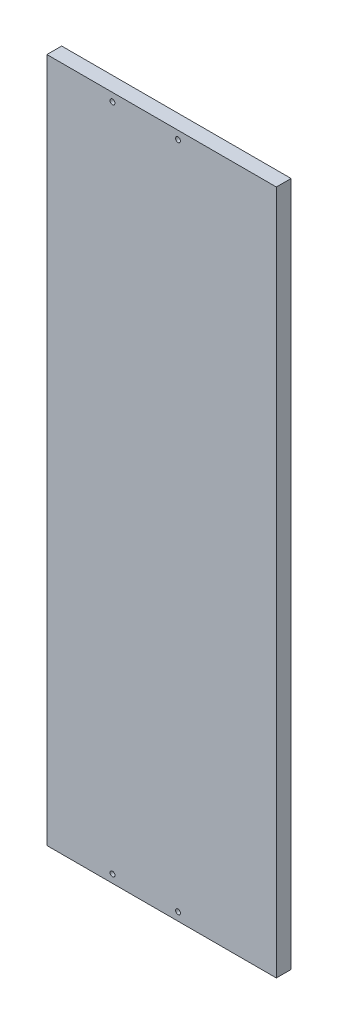
ISO-10303-21;
HEADER;
FILE_DESCRIPTION(('STEP AP214'),'2;1');
FILE_NAME('part.step','',(''),(''),'','','');
FILE_SCHEMA(('AUTOMOTIVE_DESIGN { 1 0 10303 214 1 1 1 1 }'));
ENDSEC;
DATA;
#1=APPLICATION_CONTEXT('core data for automotive mechanical design processes');
#2=APPLICATION_PROTOCOL_DEFINITION('international standard','automotive_design',2000,#1);
#3=PRODUCT_CONTEXT('',#1,'mechanical');
#4=PRODUCT('Part','Part','',(#3));
#5=PRODUCT_RELATED_PRODUCT_CATEGORY('part','',(#4));
#6=PRODUCT_DEFINITION_FORMATION('','',#4);
#7=PRODUCT_DEFINITION_CONTEXT('part definition',#1,'design');
#8=PRODUCT_DEFINITION('design','',#6,#7);
#9=PRODUCT_DEFINITION_SHAPE('','',#8);
#10=(LENGTH_UNIT() NAMED_UNIT(*) SI_UNIT(.MILLI.,.METRE.));
#11=(NAMED_UNIT(*) PLANE_ANGLE_UNIT() SI_UNIT($,.RADIAN.));
#12=(NAMED_UNIT(*) SI_UNIT($,.STERADIAN.) SOLID_ANGLE_UNIT());
#13=UNCERTAINTY_MEASURE_WITH_UNIT(LENGTH_MEASURE(1.E-05),#10,'distance_accuracy_value','');
#14=(GEOMETRIC_REPRESENTATION_CONTEXT(3) GLOBAL_UNCERTAINTY_ASSIGNED_CONTEXT((#13)) GLOBAL_UNIT_ASSIGNED_CONTEXT((#10,
#11,#12)) REPRESENTATION_CONTEXT('',''));
#15=CARTESIAN_POINT('',(0.,0.,0.));
#16=DIRECTION('',(0.,0.,1.));
#17=DIRECTION('',(1.,0.,0.));
#18=AXIS2_PLACEMENT_3D('',#15,#16,#17);
#19=CARTESIAN_POINT('',(140.,0.,0.));
#20=DIRECTION('',(1.,0.,0.));
#21=DIRECTION('',(0.,0.,-1.));
#22=AXIS2_PLACEMENT_3D('',#19,#20,#21);
#23=PLANE('',#22);
#24=DIRECTION('',(0.,1.,0.));
#25=VECTOR('',#24,1.);
#26=CARTESIAN_POINT('',(140.,0.,9.));
#27=LINE('',#26,#25);
#28=CARTESIAN_POINT('',(140.,0.,9.));
#29=VERTEX_POINT('',#28);
#30=CARTESIAN_POINT('',(140.,418.,9.));
#31=VERTEX_POINT('',#30);
#32=EDGE_CURVE('E100',#29,#31,#27,.T.);
#33=ORIENTED_EDGE('',*,*,#32,.F.);
#34=DIRECTION('',(0.,0.,1.));
#35=VECTOR('',#34,1.);
#36=CARTESIAN_POINT('',(140.,0.,0.));
#37=LINE('',#36,#35);
#38=CARTESIAN_POINT('',(140.,0.,0.));
#39=VERTEX_POINT('',#38);
#40=EDGE_CURVE('E11',#39,#29,#37,.T.);
#41=ORIENTED_EDGE('',*,*,#40,.F.);
#42=DIRECTION('',(0.,1.,0.));
#43=VECTOR('',#42,1.);
#44=CARTESIAN_POINT('',(140.,0.,0.));
#45=LINE('',#44,#43);
#46=CARTESIAN_POINT('',(140.,418.,0.));
#47=VERTEX_POINT('',#46);
#48=EDGE_CURVE('E93',#39,#47,#45,.T.);
#49=ORIENTED_EDGE('',*,*,#48,.T.);
#50=DIRECTION('',(0.,0.,1.));
#51=VECTOR('',#50,1.);
#52=CARTESIAN_POINT('',(140.,418.,0.));
#53=LINE('',#52,#51);
#54=EDGE_CURVE('E38',#47,#31,#53,.T.);
#55=ORIENTED_EDGE('',*,*,#54,.T.);
#56=EDGE_LOOP('',(#33,#41,#49,#55));
#57=FACE_BOUND('',#56,.T.);
#58=ADVANCED_FACE('F35',(#57),#23,.T.);
#59=CARTESIAN_POINT('',(0.,0.,0.));
#60=DIRECTION('',(0.,-1.,0.));
#61=DIRECTION('',(0.,0.,-1.));
#62=AXIS2_PLACEMENT_3D('',#59,#60,#61);
#63=PLANE('',#62);
#64=DIRECTION('',(1.,0.,0.));
#65=VECTOR('',#64,1.);
#66=CARTESIAN_POINT('',(0.,0.,9.));
#67=LINE('',#66,#65);
#68=CARTESIAN_POINT('',(0.,0.,9.));
#69=VERTEX_POINT('',#68);
#70=EDGE_CURVE('E95',#69,#29,#67,.T.);
#71=ORIENTED_EDGE('',*,*,#70,.F.);
#72=DIRECTION('',(0.,0.,1.));
#73=VECTOR('',#72,1.);
#74=CARTESIAN_POINT('',(0.,0.,0.));
#75=LINE('',#74,#73);
#76=CARTESIAN_POINT('',(0.,0.,0.));
#77=VERTEX_POINT('',#76);
#78=EDGE_CURVE('E44',#77,#69,#75,.T.);
#79=ORIENTED_EDGE('',*,*,#78,.F.);
#80=DIRECTION('',(1.,0.,0.));
#81=VECTOR('',#80,1.);
#82=CARTESIAN_POINT('',(0.,0.,0.));
#83=LINE('',#82,#81);
#84=EDGE_CURVE('E90',#77,#39,#83,.T.);
#85=ORIENTED_EDGE('',*,*,#84,.T.);
#86=ORIENTED_EDGE('',*,*,#40,.T.);
#87=EDGE_LOOP('',(#71,#79,#85,#86));
#88=FACE_BOUND('',#87,.T.);
#89=ADVANCED_FACE('F111',(#88),#63,.T.);
#90=CARTESIAN_POINT('',(0.,418.,0.));
#91=DIRECTION('',(-1.,0.,0.));
#92=DIRECTION('',(0.,0.,1.));
#93=AXIS2_PLACEMENT_3D('',#90,#91,#92);
#94=PLANE('',#93);
#95=DIRECTION('',(0.,-1.,0.));
#96=VECTOR('',#95,1.);
#97=CARTESIAN_POINT('',(0.,418.,9.));
#98=LINE('',#97,#96);
#99=CARTESIAN_POINT('',(0.,418.,9.));
#100=VERTEX_POINT('',#99);
#101=EDGE_CURVE('E85',#100,#69,#98,.T.);
#102=ORIENTED_EDGE('',*,*,#101,.F.);
#103=DIRECTION('',(0.,0.,1.));
#104=VECTOR('',#103,1.);
#105=CARTESIAN_POINT('',(0.,418.,0.));
#106=LINE('',#105,#104);
#107=CARTESIAN_POINT('',(0.,418.,0.));
#108=VERTEX_POINT('',#107);
#109=EDGE_CURVE('E80',#108,#100,#106,.T.);
#110=ORIENTED_EDGE('',*,*,#109,.F.);
#111=DIRECTION('',(0.,-1.,0.));
#112=VECTOR('',#111,1.);
#113=CARTESIAN_POINT('',(0.,418.,0.));
#114=LINE('',#113,#112);
#115=EDGE_CURVE('E83',#108,#77,#114,.T.);
#116=ORIENTED_EDGE('',*,*,#115,.T.);
#117=ORIENTED_EDGE('',*,*,#78,.T.);
#118=EDGE_LOOP('',(#102,#110,#116,#117));
#119=FACE_BOUND('',#118,.T.);
#120=ADVANCED_FACE('F82',(#119),#94,.T.);
#121=CARTESIAN_POINT('',(140.,418.,0.));
#122=DIRECTION('',(0.,1.,0.));
#123=DIRECTION('',(0.,0.,1.));
#124=AXIS2_PLACEMENT_3D('',#121,#122,#123);
#125=PLANE('',#124);
#126=DIRECTION('',(-1.,0.,0.));
#127=VECTOR('',#126,1.);
#128=CARTESIAN_POINT('',(140.,418.,9.));
#129=LINE('',#128,#127);
#130=EDGE_CURVE('E103',#31,#100,#129,.T.);
#131=ORIENTED_EDGE('',*,*,#130,.F.);
#132=ORIENTED_EDGE('',*,*,#54,.F.);
#133=DIRECTION('',(-1.,0.,0.));
#134=VECTOR('',#133,1.);
#135=CARTESIAN_POINT('',(140.,418.,0.));
#136=LINE('',#135,#134);
#137=EDGE_CURVE('E89',#47,#108,#136,.T.);
#138=ORIENTED_EDGE('',*,*,#137,.T.);
#139=ORIENTED_EDGE('',*,*,#109,.T.);
#140=EDGE_LOOP('',(#131,#132,#138,#139));
#141=FACE_BOUND('',#140,.T.);
#142=ADVANCED_FACE('F92',(#141),#125,.T.);
#143=CARTESIAN_POINT('',(0.,0.,0.));
#144=DIRECTION('',(0.,0.,1.));
#145=DIRECTION('',(1.,0.,0.));
#146=AXIS2_PLACEMENT_3D('',#143,#144,#145);
#147=PLANE('',#146);
#148=CARTESIAN_POINT('',(80.,5.,0.));
#149=DIRECTION('',(0.,0.,1.));
#150=DIRECTION('',(-1.,0.,0.));
#151=AXIS2_PLACEMENT_3D('',#148,#149,#150);
#152=CIRCLE('',#151,1.5);
#153=CARTESIAN_POINT('',(78.5,5.,0.));
#154=VERTEX_POINT('',#153);
#155=EDGE_CURVE('E152',#154,#154,#152,.T.);
#156=ORIENTED_EDGE('',*,*,#155,.T.);
#157=EDGE_LOOP('',(#156));
#158=FACE_BOUND('',#157,.T.);
#159=CARTESIAN_POINT('',(40.,5.,0.));
#160=DIRECTION('',(0.,0.,1.));
#161=DIRECTION('',(-1.,0.,0.));
#162=AXIS2_PLACEMENT_3D('',#159,#160,#161);
#163=CIRCLE('',#162,1.5);
#164=CARTESIAN_POINT('',(38.5,5.,0.));
#165=VERTEX_POINT('',#164);
#166=EDGE_CURVE('E160',#165,#165,#163,.T.);
#167=ORIENTED_EDGE('',*,*,#166,.T.);
#168=EDGE_LOOP('',(#167));
#169=FACE_BOUND('',#168,.T.);
#170=CARTESIAN_POINT('',(40.,413.,0.));
#171=DIRECTION('',(0.,0.,1.));
#172=DIRECTION('',(-1.,0.,0.));
#173=AXIS2_PLACEMENT_3D('',#170,#171,#172);
#174=CIRCLE('',#173,1.5);
#175=CARTESIAN_POINT('',(38.5,413.,0.));
#176=VERTEX_POINT('',#175);
#177=EDGE_CURVE('E166',#176,#176,#174,.T.);
#178=ORIENTED_EDGE('',*,*,#177,.T.);
#179=EDGE_LOOP('',(#178));
#180=FACE_BOUND('',#179,.T.);
#181=CARTESIAN_POINT('',(80.,413.,0.));
#182=DIRECTION('',(0.,0.,1.));
#183=DIRECTION('',(-1.,0.,0.));
#184=AXIS2_PLACEMENT_3D('',#181,#182,#183);
#185=CIRCLE('',#184,1.5);
#186=CARTESIAN_POINT('',(78.5,413.,0.));
#187=VERTEX_POINT('',#186);
#188=EDGE_CURVE('E104',#187,#187,#185,.T.);
#189=ORIENTED_EDGE('',*,*,#188,.T.);
#190=EDGE_LOOP('',(#189));
#191=FACE_BOUND('',#190,.T.);
#192=ORIENTED_EDGE('',*,*,#48,.F.);
#193=ORIENTED_EDGE('',*,*,#84,.F.);
#194=ORIENTED_EDGE('',*,*,#115,.F.);
#195=ORIENTED_EDGE('',*,*,#137,.F.);
#196=EDGE_LOOP('',(#192,#193,#194,#195));
#197=FACE_BOUND('',#196,.T.);
#198=ADVANCED_FACE('F88',(#158,#169,#180,#191,#197),#147,.F.);
#199=CARTESIAN_POINT('',(0.,0.,9.));
#200=DIRECTION('',(0.,0.,1.));
#201=DIRECTION('',(1.,0.,0.));
#202=AXIS2_PLACEMENT_3D('',#199,#200,#201);
#203=PLANE('',#202);
#204=CARTESIAN_POINT('',(80.,5.,9.));
#205=DIRECTION('',(0.,0.,1.));
#206=DIRECTION('',(-1.,0.,0.));
#207=AXIS2_PLACEMENT_3D('',#204,#205,#206);
#208=CIRCLE('',#207,1.5);
#209=CARTESIAN_POINT('',(78.5,5.,9.));
#210=VERTEX_POINT('',#209);
#211=EDGE_CURVE('E155',#210,#210,#208,.T.);
#212=ORIENTED_EDGE('',*,*,#211,.F.);
#213=EDGE_LOOP('',(#212));
#214=FACE_BOUND('',#213,.T.);
#215=CARTESIAN_POINT('',(40.,5.,9.));
#216=DIRECTION('',(0.,0.,1.));
#217=DIRECTION('',(-1.,0.,0.));
#218=AXIS2_PLACEMENT_3D('',#215,#216,#217);
#219=CIRCLE('',#218,1.5);
#220=CARTESIAN_POINT('',(38.5,5.,9.));
#221=VERTEX_POINT('',#220);
#222=EDGE_CURVE('E157',#221,#221,#219,.T.);
#223=ORIENTED_EDGE('',*,*,#222,.F.);
#224=EDGE_LOOP('',(#223));
#225=FACE_BOUND('',#224,.T.);
#226=CARTESIAN_POINT('',(40.,413.,9.));
#227=DIRECTION('',(0.,0.,1.));
#228=DIRECTION('',(-1.,0.,0.));
#229=AXIS2_PLACEMENT_3D('',#226,#227,#228);
#230=CIRCLE('',#229,1.5);
#231=CARTESIAN_POINT('',(38.5,413.,9.));
#232=VERTEX_POINT('',#231);
#233=EDGE_CURVE('E163',#232,#232,#230,.T.);
#234=ORIENTED_EDGE('',*,*,#233,.F.);
#235=EDGE_LOOP('',(#234));
#236=FACE_BOUND('',#235,.T.);
#237=CARTESIAN_POINT('',(80.,413.,9.));
#238=DIRECTION('',(0.,0.,1.));
#239=DIRECTION('',(-1.,0.,0.));
#240=AXIS2_PLACEMENT_3D('',#237,#238,#239);
#241=CIRCLE('',#240,1.5);
#242=CARTESIAN_POINT('',(78.5,413.,9.));
#243=VERTEX_POINT('',#242);
#244=EDGE_CURVE('E169',#243,#243,#241,.T.);
#245=ORIENTED_EDGE('',*,*,#244,.F.);
#246=EDGE_LOOP('',(#245));
#247=FACE_BOUND('',#246,.T.);
#248=ORIENTED_EDGE('',*,*,#32,.T.);
#249=ORIENTED_EDGE('',*,*,#130,.T.);
#250=ORIENTED_EDGE('',*,*,#101,.T.);
#251=ORIENTED_EDGE('',*,*,#70,.T.);
#252=EDGE_LOOP('',(#248,#249,#250,#251));
#253=FACE_BOUND('',#252,.T.);
#254=ADVANCED_FACE('F110',(#214,#225,#236,#247,#253),#203,.T.);
#255=CARTESIAN_POINT('',(80.,413.,0.));
#256=DIRECTION('',(0.,0.,1.));
#257=DIRECTION('',(1.,0.,0.));
#258=AXIS2_PLACEMENT_3D('',#255,#256,#257);
#259=CYLINDRICAL_SURFACE('',#258,1.5);
#260=ORIENTED_EDGE('',*,*,#188,.F.);
#261=EDGE_LOOP('',(#260));
#262=FACE_BOUND('',#261,.T.);
#263=ORIENTED_EDGE('',*,*,#244,.T.);
#264=EDGE_LOOP('',(#263));
#265=FACE_BOUND('',#264,.T.);
#266=ADVANCED_FACE('F129',(#262,#265),#259,.F.);
#267=CARTESIAN_POINT('',(40.,413.,0.));
#268=DIRECTION('',(0.,0.,1.));
#269=DIRECTION('',(1.,0.,0.));
#270=AXIS2_PLACEMENT_3D('',#267,#268,#269);
#271=CYLINDRICAL_SURFACE('',#270,1.5);
#272=ORIENTED_EDGE('',*,*,#177,.F.);
#273=EDGE_LOOP('',(#272));
#274=FACE_BOUND('',#273,.T.);
#275=ORIENTED_EDGE('',*,*,#233,.T.);
#276=EDGE_LOOP('',(#275));
#277=FACE_BOUND('',#276,.T.);
#278=ADVANCED_FACE('F136',(#274,#277),#271,.F.);
#279=CARTESIAN_POINT('',(40.,5.,0.));
#280=DIRECTION('',(0.,0.,1.));
#281=DIRECTION('',(1.,0.,0.));
#282=AXIS2_PLACEMENT_3D('',#279,#280,#281);
#283=CYLINDRICAL_SURFACE('',#282,1.5);
#284=ORIENTED_EDGE('',*,*,#166,.F.);
#285=EDGE_LOOP('',(#284));
#286=FACE_BOUND('',#285,.T.);
#287=ORIENTED_EDGE('',*,*,#222,.T.);
#288=EDGE_LOOP('',(#287));
#289=FACE_BOUND('',#288,.T.);
#290=ADVANCED_FACE('F140',(#286,#289),#283,.F.);
#291=CARTESIAN_POINT('',(80.,5.,0.));
#292=DIRECTION('',(0.,0.,1.));
#293=DIRECTION('',(1.,0.,0.));
#294=AXIS2_PLACEMENT_3D('',#291,#292,#293);
#295=CYLINDRICAL_SURFACE('',#294,1.5);
#296=ORIENTED_EDGE('',*,*,#155,.F.);
#297=EDGE_LOOP('',(#296));
#298=FACE_BOUND('',#297,.T.);
#299=ORIENTED_EDGE('',*,*,#211,.T.);
#300=EDGE_LOOP('',(#299));
#301=FACE_BOUND('',#300,.T.);
#302=ADVANCED_FACE('F144',(#298,#301),#295,.F.);
#303=CLOSED_SHELL('',(#58,#89,#120,#142,#198,#254,#266,#278,#290,#302));
#304=MANIFOLD_SOLID_BREP('B2',#303);
#305=ADVANCED_BREP_SHAPE_REPRESENTATION('',(#18,#304),#14);
#306=SHAPE_DEFINITION_REPRESENTATION(#9,#305);
ENDSEC;
END-ISO-10303-21;
